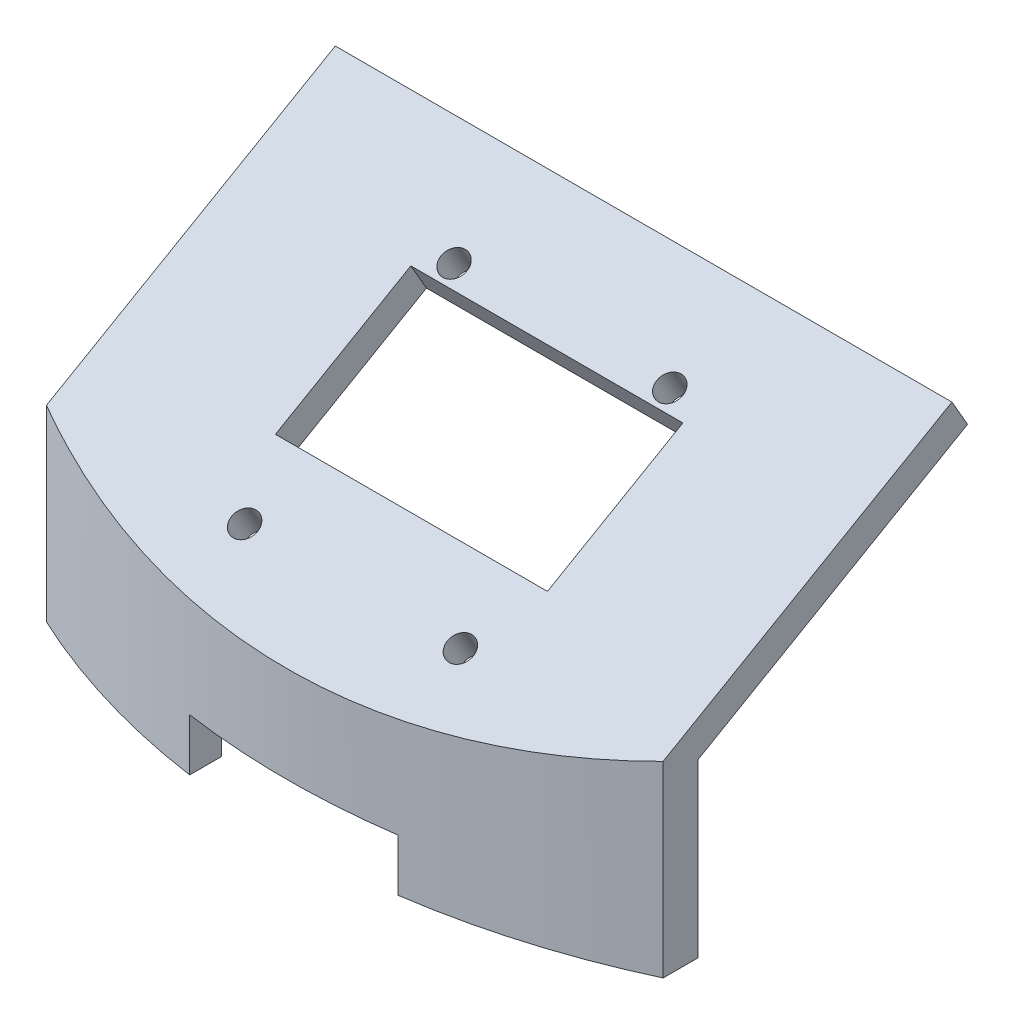
ISO-10303-21;
HEADER;
FILE_DESCRIPTION(('STEP AP214'),'2;1');
FILE_NAME('part.step','',(''),(''),'','','');
FILE_SCHEMA(('AUTOMOTIVE_DESIGN { 1 0 10303 214 1 1 1 1 }'));
ENDSEC;
DATA;
#1=APPLICATION_CONTEXT('core data for automotive mechanical design processes');
#2=APPLICATION_PROTOCOL_DEFINITION('international standard','automotive_design',2000,#1);
#3=PRODUCT_CONTEXT('',#1,'mechanical');
#4=PRODUCT('Part','Part','',(#3));
#5=PRODUCT_RELATED_PRODUCT_CATEGORY('part','',(#4));
#6=PRODUCT_DEFINITION_FORMATION('','',#4);
#7=PRODUCT_DEFINITION_CONTEXT('part definition',#1,'design');
#8=PRODUCT_DEFINITION('design','',#6,#7);
#9=PRODUCT_DEFINITION_SHAPE('','',#8);
#10=(LENGTH_UNIT() NAMED_UNIT(*) SI_UNIT(.MILLI.,.METRE.));
#11=(NAMED_UNIT(*) PLANE_ANGLE_UNIT() SI_UNIT($,.RADIAN.));
#12=(NAMED_UNIT(*) SI_UNIT($,.STERADIAN.) SOLID_ANGLE_UNIT());
#13=UNCERTAINTY_MEASURE_WITH_UNIT(LENGTH_MEASURE(1.E-05),#10,'distance_accuracy_value','');
#14=(GEOMETRIC_REPRESENTATION_CONTEXT(3) GLOBAL_UNCERTAINTY_ASSIGNED_CONTEXT((#13)) GLOBAL_UNIT_ASSIGNED_CONTEXT((#10,
#11,#12)) REPRESENTATION_CONTEXT('',''));
#15=CARTESIAN_POINT('',(0.,0.,0.));
#16=DIRECTION('',(0.,0.,1.));
#17=DIRECTION('',(1.,0.,0.));
#18=AXIS2_PLACEMENT_3D('',#15,#16,#17);
#19=CARTESIAN_POINT('',(0.,18.,0.));
#20=DIRECTION('',(0.,-1.,0.));
#21=DIRECTION('',(0.,0.,-1.));
#22=AXIS2_PLACEMENT_3D('',#19,#20,#21);
#23=CYLINDRICAL_SURFACE('',#22,70.);
#24=DIRECTION('',(0.,-1.,0.));
#25=VECTOR('',#24,1.);
#26=CARTESIAN_POINT('',(10.,18.,69.2820323027551));
#27=LINE('',#26,#25);
#28=CARTESIAN_POINT('',(10.,0.,69.2820323027551));
#29=VERTEX_POINT('',#28);
#30=CARTESIAN_POINT('',(10.,5.,69.2820323027551));
#31=VERTEX_POINT('',#30);
#32=EDGE_CURVE('E156',#29,#31,#27,.F.);
#33=ORIENTED_EDGE('',*,*,#32,.F.);
#34=CARTESIAN_POINT('',(0.,0.,0.));
#35=DIRECTION('',(0.,1.,0.));
#36=DIRECTION('',(0.,0.,1.));
#37=AXIS2_PLACEMENT_3D('',#34,#35,#36);
#38=CIRCLE('',#37,70.);
#39=CARTESIAN_POINT('',(29.5832783218491,0.,63.4415450925655));
#40=VERTEX_POINT('',#39);
#41=EDGE_CURVE('E251',#29,#40,#38,.T.);
#42=ORIENTED_EDGE('',*,*,#41,.T.);
#43=DIRECTION('',(0.,-1.,0.));
#44=VECTOR('',#43,1.);
#45=CARTESIAN_POINT('',(29.5832783218491,18.,63.4415450925655));
#46=LINE('',#45,#44);
#47=CARTESIAN_POINT('',(29.5832783218491,17.9999999999999,63.4415450925654));
#48=VERTEX_POINT('',#47);
#49=EDGE_CURVE('E278',#48,#40,#46,.T.);
#50=ORIENTED_EDGE('',*,*,#49,.F.);
#51=CARTESIAN_POINT('',(0.,54.6279931369983,0.));
#52=DIRECTION('',(0.,-0.866025403784439,-0.499999999999999));
#53=DIRECTION('',(0.,-0.499999999999999,0.866025403784439));
#54=AXIS2_PLACEMENT_3D('',#51,#52,#53);
#55=ELLIPSE('',#54,80.8290376865476,70.);
#56=CARTESIAN_POINT('',(-29.5832783218486,17.9999999999999,63.4415450925657));
#57=VERTEX_POINT('',#56);
#58=EDGE_CURVE('E223',#57,#48,#55,.F.);
#59=ORIENTED_EDGE('',*,*,#58,.F.);
#60=DIRECTION('',(0.,-1.,0.));
#61=VECTOR('',#60,1.);
#62=CARTESIAN_POINT('',(-29.5832783218486,18.,63.4415450925657));
#63=LINE('',#62,#61);
#64=CARTESIAN_POINT('',(-29.5832783218486,0.,63.4415450925657));
#65=VERTEX_POINT('',#64);
#66=EDGE_CURVE('E267',#57,#65,#63,.T.);
#67=ORIENTED_EDGE('',*,*,#66,.T.);
#68=CARTESIAN_POINT('',(-10.,0.,69.2820323027551));
#69=VERTEX_POINT('',#68);
#70=EDGE_CURVE('E170',#65,#69,#38,.T.);
#71=ORIENTED_EDGE('',*,*,#70,.T.);
#72=DIRECTION('',(0.,-1.,0.));
#73=VECTOR('',#72,1.);
#74=CARTESIAN_POINT('',(-10.,18.,69.2820323027551));
#75=LINE('',#74,#73);
#76=CARTESIAN_POINT('',(-10.,5.,69.2820323027551));
#77=VERTEX_POINT('',#76);
#78=EDGE_CURVE('E58',#77,#69,#75,.T.);
#79=ORIENTED_EDGE('',*,*,#78,.F.);
#80=CARTESIAN_POINT('',(0.,5.,0.));
#81=DIRECTION('',(0.,-1.,0.));
#82=DIRECTION('',(1.,0.,0.));
#83=AXIS2_PLACEMENT_3D('',#80,#81,#82);
#84=CIRCLE('',#83,70.);
#85=EDGE_CURVE('E149',#31,#77,#84,.T.);
#86=ORIENTED_EDGE('',*,*,#85,.F.);
#87=EDGE_LOOP('',(#33,#42,#50,#59,#67,#71,#79,#86));
#88=FACE_BOUND('',#87,.T.);
#89=ADVANCED_FACE('F44',(#88),#23,.T.);
#90=CARTESIAN_POINT('',(0.,18.,0.));
#91=DIRECTION('',(0.,-1.,0.));
#92=DIRECTION('',(0.,0.,-1.));
#93=AXIS2_PLACEMENT_3D('',#90,#91,#92);
#94=CYLINDRICAL_SURFACE('',#93,67.);
#95=DIRECTION('',(0.,-1.,0.));
#96=VECTOR('',#95,1.);
#97=CARTESIAN_POINT('',(10.,18.,66.2495283002076));
#98=LINE('',#97,#96);
#99=CARTESIAN_POINT('',(10.,5.,66.2495283002076));
#100=VERTEX_POINT('',#99);
#101=CARTESIAN_POINT('',(10.,0.,66.2495283002076));
#102=VERTEX_POINT('',#101);
#103=EDGE_CURVE('E169',#100,#102,#98,.T.);
#104=ORIENTED_EDGE('',*,*,#103,.F.);
#105=CARTESIAN_POINT('',(0.,5.,0.));
#106=DIRECTION('',(0.,-1.,0.));
#107=DIRECTION('',(1.,0.,0.));
#108=AXIS2_PLACEMENT_3D('',#105,#106,#107);
#109=CIRCLE('',#108,67.);
#110=CARTESIAN_POINT('',(-10.,5.,66.2495283002076));
#111=VERTEX_POINT('',#110);
#112=EDGE_CURVE('E11',#111,#100,#109,.F.);
#113=ORIENTED_EDGE('',*,*,#112,.F.);
#114=DIRECTION('',(0.,-1.,0.));
#115=VECTOR('',#114,1.);
#116=CARTESIAN_POINT('',(-10.,18.,66.2495283002076));
#117=LINE('',#116,#115);
#118=CARTESIAN_POINT('',(-10.,0.,66.2495283002076));
#119=VERTEX_POINT('',#118);
#120=EDGE_CURVE('E162',#119,#111,#117,.F.);
#121=ORIENTED_EDGE('',*,*,#120,.F.);
#122=CARTESIAN_POINT('',(0.,0.,0.));
#123=DIRECTION('',(0.,-1.,0.));
#124=DIRECTION('',(0.,0.,1.));
#125=AXIS2_PLACEMENT_3D('',#122,#123,#124);
#126=CIRCLE('',#125,67.);
#127=CARTESIAN_POINT('',(-29.5832783218487,0.,60.1151365608699));
#128=VERTEX_POINT('',#127);
#129=EDGE_CURVE('E262',#119,#128,#126,.T.);
#130=ORIENTED_EDGE('',*,*,#129,.T.);
#131=DIRECTION('',(0.,-1.,0.));
#132=VECTOR('',#131,1.);
#133=CARTESIAN_POINT('',(-29.5832783218487,18.,60.1151365608699));
#134=LINE('',#133,#132);
#135=CARTESIAN_POINT('',(-29.5832783218485,16.4564012460713,60.11513656087));
#136=VERTEX_POINT('',#135);
#137=EDGE_CURVE('E271',#136,#128,#134,.T.);
#138=ORIENTED_EDGE('',*,*,#137,.F.);
#139=CARTESIAN_POINT('',(0.,51.1638915218605,0.));
#140=DIRECTION('',(0.,-0.866025403784439,-0.499999999999999));
#141=DIRECTION('',(0.,-0.499999999999999,0.866025403784439));
#142=AXIS2_PLACEMENT_3D('',#139,#140,#141);
#143=ELLIPSE('',#142,77.3649360714098,67.);
#144=CARTESIAN_POINT('',(29.5832783218491,16.4564012460713,60.1151365608697));
#145=VERTEX_POINT('',#144);
#146=EDGE_CURVE('E284',#136,#145,#143,.F.);
#147=ORIENTED_EDGE('',*,*,#146,.T.);
#148=DIRECTION('',(0.,-1.,0.));
#149=VECTOR('',#148,1.);
#150=CARTESIAN_POINT('',(29.5832783218491,18.,60.1151365608697));
#151=LINE('',#150,#149);
#152=CARTESIAN_POINT('',(29.5832783218491,0.,60.1151365608697));
#153=VERTEX_POINT('',#152);
#154=EDGE_CURVE('E280',#145,#153,#151,.T.);
#155=ORIENTED_EDGE('',*,*,#154,.T.);
#156=EDGE_CURVE('E265',#153,#102,#126,.T.);
#157=ORIENTED_EDGE('',*,*,#156,.T.);
#158=EDGE_LOOP('',(#104,#113,#121,#130,#138,#147,#155,#157));
#159=FACE_BOUND('',#158,.T.);
#160=ADVANCED_FACE('F335',(#159),#94,.F.);
#161=CARTESIAN_POINT('',(0.,0.,0.));
#162=DIRECTION('',(0.,1.,0.));
#163=DIRECTION('',(0.,0.,1.));
#164=AXIS2_PLACEMENT_3D('',#161,#162,#163);
#165=PLANE('',#164);
#166=DIRECTION('',(0.,0.,1.));
#167=VECTOR('',#166,1.);
#168=CARTESIAN_POINT('',(10.,0.,0.));
#169=LINE('',#168,#167);
#170=EDGE_CURVE('E52',#102,#29,#169,.T.);
#171=ORIENTED_EDGE('',*,*,#170,.F.);
#172=ORIENTED_EDGE('',*,*,#156,.F.);
#173=DIRECTION('',(0.,0.,-1.));
#174=VECTOR('',#173,1.);
#175=CARTESIAN_POINT('',(29.5832783218491,0.,63.4415450925655));
#176=LINE('',#175,#174);
#177=EDGE_CURVE('E260',#40,#153,#176,.T.);
#178=ORIENTED_EDGE('',*,*,#177,.F.);
#179=ORIENTED_EDGE('',*,*,#41,.F.);
#180=EDGE_LOOP('',(#171,#172,#178,#179));
#181=FACE_BOUND('',#180,.T.);
#182=ADVANCED_FACE('F327',(#181),#165,.F.);
#183=DIRECTION('',(0.,0.,-1.));
#184=VECTOR('',#183,1.);
#185=CARTESIAN_POINT('',(-10.,0.,0.));
#186=LINE('',#185,#184);
#187=EDGE_CURVE('E301',#69,#119,#186,.T.);
#188=ORIENTED_EDGE('',*,*,#187,.F.);
#189=ORIENTED_EDGE('',*,*,#70,.F.);
#190=DIRECTION('',(0.,0.,1.));
#191=VECTOR('',#190,1.);
#192=CARTESIAN_POINT('',(-29.5832783218486,0.,63.4415450925657));
#193=LINE('',#192,#191);
#194=EDGE_CURVE('E268',#128,#65,#193,.T.);
#195=ORIENTED_EDGE('',*,*,#194,.F.);
#196=ORIENTED_EDGE('',*,*,#129,.F.);
#197=EDGE_LOOP('',(#188,#189,#195,#196));
#198=FACE_BOUND('',#197,.T.);
#199=ADVANCED_FACE('F339',(#198),#165,.F.);
#200=CARTESIAN_POINT('',(-29.5832783218486,18.,63.4415450925657));
#201=DIRECTION('',(1.,0.,0.));
#202=DIRECTION('',(0.,0.,-1.));
#203=AXIS2_PLACEMENT_3D('',#200,#201,#202);
#204=PLANE('',#203);
#205=ORIENTED_EDGE('',*,*,#66,.F.);
#206=DIRECTION('',(0.,0.499999999999999,-0.86602540378444));
#207=VECTOR('',#206,1.);
#208=CARTESIAN_POINT('',(-29.5832783218486,17.9999999999999,63.4415450925656));
#209=LINE('',#208,#207);
#210=CARTESIAN_POINT('',(-29.5832783218486,34.,35.7287321714634));
#211=VERTEX_POINT('',#210);
#212=EDGE_CURVE('E222',#57,#211,#209,.T.);
#213=ORIENTED_EDGE('',*,*,#212,.T.);
#214=DIRECTION('',(0.,0.866025403784439,0.499999999999999));
#215=VECTOR('',#214,1.);
#216=CARTESIAN_POINT('',(-29.5832783218486,31.4019237886466,34.2287321714634));
#217=LINE('',#216,#215);
#218=CARTESIAN_POINT('',(-29.5832783218486,31.4019237886466,34.2287321714634));
#219=VERTEX_POINT('',#218);
#220=EDGE_CURVE('E249',#219,#211,#217,.T.);
#221=ORIENTED_EDGE('',*,*,#220,.F.);
#222=DIRECTION('',(0.,0.499999999999999,-0.866025403784439));
#223=VECTOR('',#222,1.);
#224=CARTESIAN_POINT('',(-29.5832783218486,15.4019237886466,61.9415450925656));
#225=LINE('',#224,#223);
#226=EDGE_CURVE('E227',#136,#219,#225,.T.);
#227=ORIENTED_EDGE('',*,*,#226,.F.);
#228=ORIENTED_EDGE('',*,*,#137,.T.);
#229=ORIENTED_EDGE('',*,*,#194,.T.);
#230=EDGE_LOOP('',(#205,#213,#221,#227,#228,#229));
#231=FACE_BOUND('',#230,.T.);
#232=ADVANCED_FACE('F340',(#231),#204,.F.);
#233=CARTESIAN_POINT('',(0.,40.9709948527488,23.6546149072012));
#234=DIRECTION('',(0.,-0.866025403784439,-0.499999999999999));
#235=DIRECTION('',(0.,0.499999999999999,-0.866025403784439));
#236=AXIS2_PLACEMENT_3D('',#233,#234,#235);
#237=PLANE('',#236);
#238=CARTESIAN_POINT('',(-10.3499999999999,17.875,63.6580514435116));
#239=DIRECTION('',(0.,0.866025403784439,0.499999999999998));
#240=DIRECTION('',(0.,-0.499999999999999,0.86602540378444));
#241=AXIS2_PLACEMENT_3D('',#238,#239,#240);
#242=CIRCLE('',#241,1.25);
#243=CARTESIAN_POINT('',(-10.3499999999999,17.25,64.7405831982421));
#244=VERTEX_POINT('',#243);
#245=EDGE_CURVE('E160',#244,#244,#242,.T.);
#246=ORIENTED_EDGE('',*,*,#245,.F.);
#247=EDGE_LOOP('',(#246));
#248=FACE_BOUND('',#247,.T.);
#249=CARTESIAN_POINT('',(10.3500000000001,17.875,63.6580514435116));
#250=DIRECTION('',(0.,0.866025403784439,0.499999999999998));
#251=DIRECTION('',(0.,-0.499999999999999,0.86602540378444));
#252=AXIS2_PLACEMENT_3D('',#249,#250,#251);
#253=CIRCLE('',#252,1.25);
#254=CARTESIAN_POINT('',(10.3500000000001,17.25,64.7405831982421));
#255=VERTEX_POINT('',#254);
#256=EDGE_CURVE('E190',#255,#255,#253,.T.);
#257=ORIENTED_EDGE('',*,*,#256,.F.);
#258=EDGE_LOOP('',(#257));
#259=FACE_BOUND('',#258,.T.);
#260=CARTESIAN_POINT('',(-10.3499999999999,29.475,43.5662620757126));
#261=DIRECTION('',(0.,0.866025403784439,0.499999999999998));
#262=DIRECTION('',(0.,-0.499999999999999,0.86602540378444));
#263=AXIS2_PLACEMENT_3D('',#260,#261,#262);
#264=CIRCLE('',#263,1.25);
#265=CARTESIAN_POINT('',(-10.3499999999999,28.85,44.6487938304432));
#266=VERTEX_POINT('',#265);
#267=EDGE_CURVE('E182',#266,#266,#264,.T.);
#268=ORIENTED_EDGE('',*,*,#267,.F.);
#269=EDGE_LOOP('',(#268));
#270=FACE_BOUND('',#269,.T.);
#271=CARTESIAN_POINT('',(10.3500000000001,29.4749999999999,43.5662620757126));
#272=DIRECTION('',(0.,0.866025403784439,0.499999999999998));
#273=DIRECTION('',(0.,-0.499999999999999,0.86602540378444));
#274=AXIS2_PLACEMENT_3D('',#271,#272,#273);
#275=CIRCLE('',#274,1.25);
#276=CARTESIAN_POINT('',(10.3500000000001,28.8499999999999,44.6487938304431));
#277=VERTEX_POINT('',#276);
#278=EDGE_CURVE('E177',#277,#277,#275,.T.);
#279=ORIENTED_EDGE('',*,*,#278,.F.);
#280=EDGE_LOOP('',(#279));
#281=FACE_BOUND('',#280,.T.);
#282=DIRECTION('',(-1.,0.,0.));
#283=VECTOR('',#282,1.);
#284=CARTESIAN_POINT('',(-13.0499999999999,28.64,45.0125245000326));
#285=LINE('',#284,#283);
#286=CARTESIAN_POINT('',(13.0500000000001,28.6399999999999,45.0125245000326));
#287=VERTEX_POINT('',#286);
#288=CARTESIAN_POINT('',(-13.0499999999999,28.64,45.0125245000326));
#289=VERTEX_POINT('',#288);
#290=EDGE_CURVE('E197',#287,#289,#285,.T.);
#291=ORIENTED_EDGE('',*,*,#290,.F.);
#292=DIRECTION('',(0.,0.499999999999999,-0.86602540378444));
#293=VECTOR('',#292,1.);
#294=CARTESIAN_POINT('',(13.0500000000001,21.1399999999999,58.0029055567992));
#295=LINE('',#294,#293);
#296=CARTESIAN_POINT('',(13.0500000000001,21.1399999999999,58.0029055567992));
#297=VERTEX_POINT('',#296);
#298=EDGE_CURVE('E68',#297,#287,#295,.T.);
#299=ORIENTED_EDGE('',*,*,#298,.F.);
#300=DIRECTION('',(1.,0.,0.));
#301=VECTOR('',#300,1.);
#302=CARTESIAN_POINT('',(-13.0499999999999,21.14,58.0029055567992));
#303=LINE('',#302,#301);
#304=CARTESIAN_POINT('',(-13.0499999999999,21.14,58.0029055567992));
#305=VERTEX_POINT('',#304);
#306=EDGE_CURVE('E204',#305,#297,#303,.T.);
#307=ORIENTED_EDGE('',*,*,#306,.F.);
#308=DIRECTION('',(0.,-0.499999999999998,0.86602540378444));
#309=VECTOR('',#308,1.);
#310=CARTESIAN_POINT('',(-13.0499999999999,21.14,58.0029055567992));
#311=LINE('',#310,#309);
#312=EDGE_CURVE('E196',#289,#305,#311,.T.);
#313=ORIENTED_EDGE('',*,*,#312,.F.);
#314=EDGE_LOOP('',(#291,#299,#307,#313));
#315=FACE_BOUND('',#314,.T.);
#316=ORIENTED_EDGE('',*,*,#58,.T.);
#317=DIRECTION('',(0.,-0.499999999999998,0.86602540378444));
#318=VECTOR('',#317,1.);
#319=CARTESIAN_POINT('',(29.5832783218491,17.9999999999999,63.4415450925654));
#320=LINE('',#319,#318);
#321=CARTESIAN_POINT('',(29.5832783218491,33.9999999999999,35.7287321714633));
#322=VERTEX_POINT('',#321);
#323=EDGE_CURVE('E233',#322,#48,#320,.T.);
#324=ORIENTED_EDGE('',*,*,#323,.F.);
#325=DIRECTION('',(1.,0.,0.));
#326=VECTOR('',#325,1.);
#327=CARTESIAN_POINT('',(-29.5832783218486,34.,35.7287321714634));
#328=LINE('',#327,#326);
#329=EDGE_CURVE('E239',#211,#322,#328,.T.);
#330=ORIENTED_EDGE('',*,*,#329,.F.);
#331=ORIENTED_EDGE('',*,*,#212,.F.);
#332=EDGE_LOOP('',(#316,#324,#330,#331));
#333=FACE_BOUND('',#332,.T.);
#334=ADVANCED_FACE('F350',(#248,#259,#270,#281,#315,#333),#237,.F.);
#335=CARTESIAN_POINT('',(29.5832783218491,18.,63.4415450925655));
#336=DIRECTION('',(-1.,0.,0.));
#337=DIRECTION('',(0.,0.,1.));
#338=AXIS2_PLACEMENT_3D('',#335,#336,#337);
#339=PLANE('',#338);
#340=ORIENTED_EDGE('',*,*,#323,.T.);
#341=ORIENTED_EDGE('',*,*,#49,.T.);
#342=ORIENTED_EDGE('',*,*,#177,.T.);
#343=ORIENTED_EDGE('',*,*,#154,.F.);
#344=DIRECTION('',(0.,-0.499999999999999,0.86602540378444));
#345=VECTOR('',#344,1.);
#346=CARTESIAN_POINT('',(29.5832783218491,15.4019237886466,61.9415450925654));
#347=LINE('',#346,#345);
#348=CARTESIAN_POINT('',(29.5832783218491,31.4019237886465,34.2287321714633));
#349=VERTEX_POINT('',#348);
#350=EDGE_CURVE('E234',#349,#145,#347,.T.);
#351=ORIENTED_EDGE('',*,*,#350,.F.);
#352=DIRECTION('',(0.,0.866025403784439,0.499999999999999));
#353=VECTOR('',#352,1.);
#354=CARTESIAN_POINT('',(29.5832783218491,31.4019237886465,34.2287321714633));
#355=LINE('',#354,#353);
#356=EDGE_CURVE('E240',#349,#322,#355,.T.);
#357=ORIENTED_EDGE('',*,*,#356,.T.);
#358=EDGE_LOOP('',(#340,#341,#342,#343,#351,#357));
#359=FACE_BOUND('',#358,.T.);
#360=ADVANCED_FACE('F356',(#359),#339,.F.);
#361=CARTESIAN_POINT('',(-29.5832783218486,31.4019237886466,34.2287321714634));
#362=DIRECTION('',(0.,-0.499999999999999,0.866025403784439));
#363=DIRECTION('',(0.,-0.866025403784439,-0.499999999999999));
#364=AXIS2_PLACEMENT_3D('',#361,#362,#363);
#365=PLANE('',#364);
#366=ORIENTED_EDGE('',*,*,#329,.T.);
#367=ORIENTED_EDGE('',*,*,#356,.F.);
#368=DIRECTION('',(1.,0.,0.));
#369=VECTOR('',#368,1.);
#370=CARTESIAN_POINT('',(-29.5832783218486,31.4019237886466,34.2287321714634));
#371=LINE('',#370,#369);
#372=EDGE_CURVE('E229',#219,#349,#371,.T.);
#373=ORIENTED_EDGE('',*,*,#372,.F.);
#374=ORIENTED_EDGE('',*,*,#220,.T.);
#375=EDGE_LOOP('',(#366,#367,#373,#374));
#376=FACE_BOUND('',#375,.T.);
#377=ADVANCED_FACE('F359',(#376),#365,.F.);
#378=CARTESIAN_POINT('',(0.,38.3729186413955,22.1546149072012));
#379=DIRECTION('',(0.,-0.866025403784439,-0.499999999999999));
#380=DIRECTION('',(0.,0.499999999999999,-0.866025403784439));
#381=AXIS2_PLACEMENT_3D('',#378,#379,#380);
#382=PLANE('',#381);
#383=CARTESIAN_POINT('',(-10.3499999999999,15.2769237886466,62.1580514435116));
#384=DIRECTION('',(0.,-0.866025403784439,-0.499999999999999));
#385=DIRECTION('',(0.,0.499999999999999,-0.866025403784439));
#386=AXIS2_PLACEMENT_3D('',#383,#384,#385);
#387=CIRCLE('',#386,1.25);
#388=CARTESIAN_POINT('',(-10.3499999999999,14.6519237886466,63.2405831982421));
#389=VERTEX_POINT('',#388);
#390=EDGE_CURVE('E228',#389,#389,#387,.T.);
#391=ORIENTED_EDGE('',*,*,#390,.F.);
#392=EDGE_LOOP('',(#391));
#393=FACE_BOUND('',#392,.T.);
#394=CARTESIAN_POINT('',(10.3500000000001,15.2769237886466,62.1580514435115));
#395=DIRECTION('',(0.,-0.866025403784439,-0.499999999999999));
#396=DIRECTION('',(0.,0.499999999999999,-0.866025403784439));
#397=AXIS2_PLACEMENT_3D('',#394,#395,#396);
#398=CIRCLE('',#397,1.25);
#399=CARTESIAN_POINT('',(10.3500000000001,14.6519237886466,63.2405831982421));
#400=VERTEX_POINT('',#399);
#401=EDGE_CURVE('E307',#400,#400,#398,.T.);
#402=ORIENTED_EDGE('',*,*,#401,.F.);
#403=EDGE_LOOP('',(#402));
#404=FACE_BOUND('',#403,.T.);
#405=CARTESIAN_POINT('',(-10.3499999999999,26.8769237886466,42.0662620757126));
#406=DIRECTION('',(0.,-0.866025403784439,-0.499999999999999));
#407=DIRECTION('',(0.,0.499999999999999,-0.866025403784439));
#408=AXIS2_PLACEMENT_3D('',#405,#406,#407);
#409=CIRCLE('',#408,1.25);
#410=CARTESIAN_POINT('',(-10.3499999999999,26.2519237886466,43.1487938304431));
#411=VERTEX_POINT('',#410);
#412=EDGE_CURVE('E304',#411,#411,#409,.T.);
#413=ORIENTED_EDGE('',*,*,#412,.F.);
#414=EDGE_LOOP('',(#413));
#415=FACE_BOUND('',#414,.T.);
#416=CARTESIAN_POINT('',(10.3500000000001,26.8769237886466,42.0662620757126));
#417=DIRECTION('',(0.,-0.866025403784439,-0.499999999999999));
#418=DIRECTION('',(0.,0.499999999999999,-0.866025403784439));
#419=AXIS2_PLACEMENT_3D('',#416,#417,#418);
#420=CIRCLE('',#419,1.25);
#421=CARTESIAN_POINT('',(10.3500000000001,26.2519237886466,43.1487938304431));
#422=VERTEX_POINT('',#421);
#423=EDGE_CURVE('E215',#422,#422,#420,.T.);
#424=ORIENTED_EDGE('',*,*,#423,.F.);
#425=EDGE_LOOP('',(#424));
#426=FACE_BOUND('',#425,.T.);
#427=DIRECTION('',(0.,-0.499999999999999,0.866025403784439));
#428=VECTOR('',#427,1.);
#429=CARTESIAN_POINT('',(13.0500000000001,38.3729186413954,22.1546149072012));
#430=LINE('',#429,#428);
#431=CARTESIAN_POINT('',(13.0500000000001,26.0419237886466,43.5125245000326));
#432=VERTEX_POINT('',#431);
#433=CARTESIAN_POINT('',(13.0500000000001,18.5419237886466,56.5029055567992));
#434=VERTEX_POINT('',#433);
#435=EDGE_CURVE('E296',#432,#434,#430,.T.);
#436=ORIENTED_EDGE('',*,*,#435,.F.);
#437=DIRECTION('',(1.,0.,0.));
#438=VECTOR('',#437,1.);
#439=CARTESIAN_POINT('',(0.,26.0419237886466,43.5125245000326));
#440=LINE('',#439,#438);
#441=CARTESIAN_POINT('',(-13.0499999999999,26.0419237886466,43.5125245000326));
#442=VERTEX_POINT('',#441);
#443=EDGE_CURVE('E286',#442,#432,#440,.T.);
#444=ORIENTED_EDGE('',*,*,#443,.F.);
#445=DIRECTION('',(0.,0.499999999999999,-0.866025403784439));
#446=VECTOR('',#445,1.);
#447=CARTESIAN_POINT('',(-13.0499999999999,38.3729186413955,22.1546149072012));
#448=LINE('',#447,#446);
#449=CARTESIAN_POINT('',(-13.0499999999999,18.5419237886466,56.5029055567992));
#450=VERTEX_POINT('',#449);
#451=EDGE_CURVE('E293',#450,#442,#448,.T.);
#452=ORIENTED_EDGE('',*,*,#451,.F.);
#453=DIRECTION('',(-1.,0.,0.));
#454=VECTOR('',#453,1.);
#455=CARTESIAN_POINT('',(0.,18.5419237886466,56.5029055567992));
#456=LINE('',#455,#454);
#457=EDGE_CURVE('E294',#434,#450,#456,.T.);
#458=ORIENTED_EDGE('',*,*,#457,.F.);
#459=EDGE_LOOP('',(#436,#444,#452,#458));
#460=FACE_BOUND('',#459,.T.);
#461=ORIENTED_EDGE('',*,*,#146,.F.);
#462=ORIENTED_EDGE('',*,*,#226,.T.);
#463=ORIENTED_EDGE('',*,*,#372,.T.);
#464=ORIENTED_EDGE('',*,*,#350,.T.);
#465=EDGE_LOOP('',(#461,#462,#463,#464));
#466=FACE_BOUND('',#465,.T.);
#467=ADVANCED_FACE('F366',(#393,#404,#415,#426,#460,#466),#382,.T.);
#468=CARTESIAN_POINT('',(13.0500000000001,15.0778221735089,54.5029055567992));
#469=DIRECTION('',(1.,0.,0.));
#470=DIRECTION('',(0.,1.,0.));
#471=AXIS2_PLACEMENT_3D('',#468,#469,#470);
#472=PLANE('',#471);
#473=ORIENTED_EDGE('',*,*,#435,.T.);
#474=DIRECTION('',(0.,0.866025403784439,0.499999999999999));
#475=VECTOR('',#474,1.);
#476=CARTESIAN_POINT('',(13.0500000000001,15.0778221735089,54.5029055567992));
#477=LINE('',#476,#475);
#478=EDGE_CURVE('E209',#434,#297,#477,.T.);
#479=ORIENTED_EDGE('',*,*,#478,.T.);
#480=ORIENTED_EDGE('',*,*,#298,.T.);
#481=DIRECTION('',(0.,0.866025403784439,0.499999999999999));
#482=VECTOR('',#481,1.);
#483=CARTESIAN_POINT('',(13.0500000000001,22.5778221735089,41.5125245000326));
#484=LINE('',#483,#482);
#485=EDGE_CURVE('E206',#432,#287,#484,.T.);
#486=ORIENTED_EDGE('',*,*,#485,.F.);
#487=EDGE_LOOP('',(#473,#479,#480,#486));
#488=FACE_BOUND('',#487,.T.);
#489=ADVANCED_FACE('F382',(#488),#472,.F.);
#490=CARTESIAN_POINT('',(-13.0499999999999,15.0778221735089,54.5029055567992));
#491=DIRECTION('',(0.,-0.499999999999999,0.866025403784439));
#492=DIRECTION('',(0.,-0.866025403784439,-0.499999999999999));
#493=AXIS2_PLACEMENT_3D('',#490,#491,#492);
#494=PLANE('',#493);
#495=ORIENTED_EDGE('',*,*,#457,.T.);
#496=DIRECTION('',(0.,0.866025403784439,0.499999999999999));
#497=VECTOR('',#496,1.);
#498=CARTESIAN_POINT('',(-13.0499999999999,15.0778221735089,54.5029055567992));
#499=LINE('',#498,#497);
#500=EDGE_CURVE('E214',#450,#305,#499,.T.);
#501=ORIENTED_EDGE('',*,*,#500,.T.);
#502=ORIENTED_EDGE('',*,*,#306,.T.);
#503=ORIENTED_EDGE('',*,*,#478,.F.);
#504=EDGE_LOOP('',(#495,#501,#502,#503));
#505=FACE_BOUND('',#504,.T.);
#506=ADVANCED_FACE('F390',(#505),#494,.F.);
#507=CARTESIAN_POINT('',(-13.0499999999999,15.0778221735089,54.5029055567992));
#508=DIRECTION('',(-1.,0.,0.));
#509=DIRECTION('',(0.,-1.,0.));
#510=AXIS2_PLACEMENT_3D('',#507,#508,#509);
#511=PLANE('',#510);
#512=ORIENTED_EDGE('',*,*,#451,.T.);
#513=DIRECTION('',(0.,0.866025403784439,0.499999999999999));
#514=VECTOR('',#513,1.);
#515=CARTESIAN_POINT('',(-13.0499999999999,22.5778221735089,41.5125245000326));
#516=LINE('',#515,#514);
#517=EDGE_CURVE('E217',#442,#289,#516,.T.);
#518=ORIENTED_EDGE('',*,*,#517,.T.);
#519=ORIENTED_EDGE('',*,*,#312,.T.);
#520=ORIENTED_EDGE('',*,*,#500,.F.);
#521=EDGE_LOOP('',(#512,#518,#519,#520));
#522=FACE_BOUND('',#521,.T.);
#523=ADVANCED_FACE('F398',(#522),#511,.F.);
#524=CARTESIAN_POINT('',(-13.0499999999999,22.5778221735089,41.5125245000326));
#525=DIRECTION('',(0.,0.499999999999999,-0.866025403784439));
#526=DIRECTION('',(0.,0.866025403784439,0.499999999999999));
#527=AXIS2_PLACEMENT_3D('',#524,#525,#526);
#528=PLANE('',#527);
#529=ORIENTED_EDGE('',*,*,#443,.T.);
#530=ORIENTED_EDGE('',*,*,#485,.T.);
#531=ORIENTED_EDGE('',*,*,#290,.T.);
#532=ORIENTED_EDGE('',*,*,#517,.F.);
#533=EDGE_LOOP('',(#529,#530,#531,#532));
#534=FACE_BOUND('',#533,.T.);
#535=ADVANCED_FACE('F395',(#534),#528,.F.);
#536=CARTESIAN_POINT('',(10.3500000000001,23.4128221735089,40.0662620757126));
#537=DIRECTION('',(0.,0.866025403784439,0.499999999999999));
#538=DIRECTION('',(0.,-0.499999999999999,0.866025403784439));
#539=AXIS2_PLACEMENT_3D('',#536,#537,#538);
#540=CYLINDRICAL_SURFACE('',#539,1.25);
#541=CARTESIAN_POINT('',(10.3500000000001,26.2519237886466,43.1487938304431));
#542=CARTESIAN_POINT('',(10.3500000000001,26.2789870825149,43.1644188304431));
#543=CARTESIAN_POINT('',(10.3500000000001,26.3060503763831,43.1800438304431));
#544=CARTESIAN_POINT('',(10.3500000000001,26.3601769641196,43.2112938304431));
#545=CARTESIAN_POINT('',(10.3500000000001,26.3872402579879,43.2269188304431));
#546=CARTESIAN_POINT('',(10.3500000000001,26.4413668457244,43.2581688304431));
#547=CARTESIAN_POINT('',(10.3500000000001,26.4684301395927,43.2737938304431));
#548=CARTESIAN_POINT('',(10.3500000000001,26.5225567273292,43.3050438304431));
#549=CARTESIAN_POINT('',(10.3500000000001,26.5496200211975,43.3206688304431));
#550=CARTESIAN_POINT('',(10.3500000000001,26.603746608934,43.3519188304431));
#551=CARTESIAN_POINT('',(10.3500000000001,26.6308099028023,43.3675438304431));
#552=CARTESIAN_POINT('',(10.3500000000001,26.6849364905388,43.3987938304431));
#553=CARTESIAN_POINT('',(10.3500000000001,26.7119997844071,43.4144188304431));
#554=CARTESIAN_POINT('',(10.3500000000001,26.7661263721436,43.4456688304431));
#555=CARTESIAN_POINT('',(10.3500000000001,26.7931896660119,43.4612938304431));
#556=CARTESIAN_POINT('',(10.3500000000001,26.8473162537484,43.4925438304431));
#557=CARTESIAN_POINT('',(10.3500000000001,26.8743795476167,43.5081688304431));
#558=CARTESIAN_POINT('',(10.3500000000001,26.9285061353532,43.5394188304431));
#559=CARTESIAN_POINT('',(10.3500000000001,26.9555694292215,43.5550438304431));
#560=CARTESIAN_POINT('',(10.3500000000001,27.009696016958,43.5862938304431));
#561=CARTESIAN_POINT('',(10.3500000000001,27.0367593108262,43.6019188304431));
#562=CARTESIAN_POINT('',(10.3500000000001,27.0908858985628,43.6331688304431));
#563=CARTESIAN_POINT('',(10.3500000000001,27.117949192431,43.6487938304431));
#564=CARTESIAN_POINT('',(10.3500000000001,27.1720757801676,43.6800438304431));
#565=CARTESIAN_POINT('',(10.3500000000001,27.1991390740358,43.6956688304431));
#566=CARTESIAN_POINT('',(10.3500000000001,27.2532656617724,43.7269188304431));
#567=CARTESIAN_POINT('',(10.3500000000001,27.2803289556406,43.7425438304431));
#568=CARTESIAN_POINT('',(10.3500000000001,27.3344555433771,43.7737938304431));
#569=CARTESIAN_POINT('',(10.3500000000001,27.3615188372454,43.7894188304431));
#570=CARTESIAN_POINT('',(10.3500000000001,27.4156454249819,43.8206688304431));
#571=CARTESIAN_POINT('',(10.3500000000001,27.4427087188502,43.8362938304431));
#572=CARTESIAN_POINT('',(10.3500000000001,27.4968353065867,43.8675438304431));
#573=CARTESIAN_POINT('',(10.3500000000001,27.523898600455,43.8831688304431));
#574=CARTESIAN_POINT('',(10.3500000000001,27.5780251881915,43.9144188304431));
#575=CARTESIAN_POINT('',(10.3500000000001,27.6050884820598,43.9300438304431));
#576=CARTESIAN_POINT('',(10.3500000000001,27.6592150697963,43.9612938304431));
#577=CARTESIAN_POINT('',(10.3500000000001,27.6862783636646,43.9769188304431));
#578=CARTESIAN_POINT('',(10.3500000000001,27.7404049514011,44.0081688304431));
#579=CARTESIAN_POINT('',(10.3500000000001,27.7674682452694,44.0237938304431));
#580=CARTESIAN_POINT('',(10.3500000000001,27.8215948330059,44.0550438304431));
#581=CARTESIAN_POINT('',(10.3500000000001,27.8486581268742,44.0706688304431));
#582=CARTESIAN_POINT('',(10.3500000000001,27.9027847146107,44.1019188304431));
#583=CARTESIAN_POINT('',(10.3500000000001,27.929848008479,44.1175438304431));
#584=CARTESIAN_POINT('',(10.3500000000001,27.9839745962155,44.1487938304431));
#585=CARTESIAN_POINT('',(10.3500000000001,28.0110378900838,44.1644188304431));
#586=CARTESIAN_POINT('',(10.3500000000001,28.0651644778203,44.1956688304431));
#587=CARTESIAN_POINT('',(10.3500000000001,28.0922277716885,44.2112938304431));
#588=CARTESIAN_POINT('',(10.3500000000001,28.1463543594251,44.2425438304431));
#589=CARTESIAN_POINT('',(10.3500000000001,28.1734176532933,44.2581688304431));
#590=CARTESIAN_POINT('',(10.3500000000001,28.2275442410299,44.2894188304431));
#591=CARTESIAN_POINT('',(10.3500000000001,28.2546075348981,44.3050438304431));
#592=CARTESIAN_POINT('',(10.3500000000001,28.3087341226347,44.3362938304431));
#593=CARTESIAN_POINT('',(10.3500000000001,28.3357974165029,44.3519188304431));
#594=CARTESIAN_POINT('',(10.3500000000001,28.3899240042394,44.3831688304431));
#595=CARTESIAN_POINT('',(10.3500000000001,28.4169872981077,44.3987938304431));
#596=CARTESIAN_POINT('',(10.3500000000001,28.4711138858442,44.4300438304431));
#597=CARTESIAN_POINT('',(10.3500000000001,28.4981771797125,44.4456688304431));
#598=CARTESIAN_POINT('',(10.3500000000001,28.552303767449,44.4769188304431));
#599=CARTESIAN_POINT('',(10.3500000000001,28.5793670613173,44.4925438304431));
#600=CARTESIAN_POINT('',(10.3500000000001,28.6334936490538,44.5237938304431));
#601=CARTESIAN_POINT('',(10.3500000000001,28.6605569429221,44.5394188304431));
#602=CARTESIAN_POINT('',(10.3500000000001,28.7146835306586,44.5706688304431));
#603=CARTESIAN_POINT('',(10.3500000000001,28.7417468245269,44.5862938304431));
#604=CARTESIAN_POINT('',(10.3500000000001,28.7958734122634,44.6175438304431));
#605=CARTESIAN_POINT('',(10.3500000000001,28.8229367061317,44.6331688304431));
#606=CARTESIAN_POINT('',(10.3500000000001,28.8499999999999,44.6487938304431));
#607=B_SPLINE_CURVE_WITH_KNOTS('',3,(#541,#542,#543,#544,#545,#546,#547,#548,#549,#550,#551,
#552,#553,#554,#555,#556,#557,#558,#559,#560,#561,#562,#563,#564,#565,#566,#567,#568,#569,#570,
#571,#572,#573,#574,#575,#576,#577,#578,#579,#580,#581,#582,#583,#584,#585,#586,#587,#588,#589,
#590,#591,#592,#593,#594,#595,#596,#597,#598,#599,#600,#601,#602,#603,#604,#605,#606),
.UNSPECIFIED.,.F.,.F.,(4,2,2,2,2,2,2,2,2,2,2,2,2,2,2,2,2,2,2,2,2,2,2,2,2,2,2,2,2,2,2,2,4),(0.,
0.0937500000000012,0.187500000000002,0.281250000000004,0.375000000000005,0.468750000000003,
0.562500000000004,0.656250000000008,0.750000000000009,0.843750000000011,0.937500000000011,
1.03125000000001,1.12500000000001,1.21875000000001,1.31250000000002,1.40625000000001,
1.50000000000001,1.59375000000002,1.68750000000002,1.78125000000002,1.87500000000002,
1.96875000000002,2.06250000000002,2.15625000000003,2.25000000000003,2.34375000000003,
2.43750000000003,2.53125000000003,2.62500000000003,2.71875000000003,2.81250000000004,
2.90625000000004,3.00000000000004),.UNSPECIFIED.);
#608=EDGE_CURVE('BSEAM391',#422,#277,#607,.T.);
#609=ORIENTED_EDGE('',*,*,#423,.T.);
#610=ORIENTED_EDGE('',*,*,#278,.T.);
#611=ORIENTED_EDGE('',*,*,#608,.T.);
#612=ORIENTED_EDGE('',*,*,#608,.F.);
#613=EDGE_LOOP('',(#609,#611,#610,#612));
#614=FACE_BOUND('',#613,.T.);
#615=ADVANCED_FACE('F391',(#614),#540,.F.);
#616=CARTESIAN_POINT('',(-10.3499999999999,23.4128221735089,40.0662620757126));
#617=DIRECTION('',(0.,0.866025403784439,0.499999999999999));
#618=DIRECTION('',(0.,-0.499999999999999,0.866025403784439));
#619=AXIS2_PLACEMENT_3D('',#616,#617,#618);
#620=CYLINDRICAL_SURFACE('',#619,1.25);
#621=CARTESIAN_POINT('',(-10.3499999999999,26.2519237886466,43.1487938304431));
#622=CARTESIAN_POINT('',(-10.3499999999999,26.2789870825149,43.1644188304431));
#623=CARTESIAN_POINT('',(-10.3499999999999,26.3060503763831,43.1800438304431));
#624=CARTESIAN_POINT('',(-10.3499999999999,26.3601769641197,43.2112938304431));
#625=CARTESIAN_POINT('',(-10.3499999999999,26.3872402579879,43.2269188304431));
#626=CARTESIAN_POINT('',(-10.3499999999999,26.4413668457245,43.2581688304431));
#627=CARTESIAN_POINT('',(-10.3499999999999,26.4684301395927,43.2737938304431));
#628=CARTESIAN_POINT('',(-10.3499999999999,26.5225567273293,43.3050438304431));
#629=CARTESIAN_POINT('',(-10.3499999999999,26.5496200211975,43.3206688304431));
#630=CARTESIAN_POINT('',(-10.3499999999999,26.603746608934,43.3519188304431));
#631=CARTESIAN_POINT('',(-10.3499999999999,26.6308099028023,43.3675438304431));
#632=CARTESIAN_POINT('',(-10.3499999999999,26.6849364905388,43.3987938304431));
#633=CARTESIAN_POINT('',(-10.3499999999999,26.7119997844071,43.4144188304431));
#634=CARTESIAN_POINT('',(-10.3499999999999,26.7661263721436,43.4456688304431));
#635=CARTESIAN_POINT('',(-10.3499999999999,26.7931896660119,43.4612938304431));
#636=CARTESIAN_POINT('',(-10.3499999999999,26.8473162537484,43.4925438304431));
#637=CARTESIAN_POINT('',(-10.3499999999999,26.8743795476167,43.5081688304431));
#638=CARTESIAN_POINT('',(-10.3499999999999,26.9285061353532,43.5394188304431));
#639=CARTESIAN_POINT('',(-10.3499999999999,26.9555694292215,43.5550438304431));
#640=CARTESIAN_POINT('',(-10.3499999999999,27.009696016958,43.5862938304431));
#641=CARTESIAN_POINT('',(-10.3499999999999,27.0367593108263,43.6019188304431));
#642=CARTESIAN_POINT('',(-10.3499999999999,27.0908858985628,43.6331688304431));
#643=CARTESIAN_POINT('',(-10.3499999999999,27.1179491924311,43.6487938304431));
#644=CARTESIAN_POINT('',(-10.3499999999999,27.1720757801676,43.6800438304431));
#645=CARTESIAN_POINT('',(-10.3499999999999,27.1991390740359,43.6956688304431));
#646=CARTESIAN_POINT('',(-10.3499999999999,27.2532656617724,43.7269188304431));
#647=CARTESIAN_POINT('',(-10.3499999999999,27.2803289556406,43.7425438304431));
#648=CARTESIAN_POINT('',(-10.3499999999999,27.3344555433772,43.7737938304431));
#649=CARTESIAN_POINT('',(-10.3499999999999,27.3615188372454,43.7894188304431));
#650=CARTESIAN_POINT('',(-10.3499999999999,27.415645424982,43.8206688304431));
#651=CARTESIAN_POINT('',(-10.3499999999999,27.4427087188502,43.8362938304431));
#652=CARTESIAN_POINT('',(-10.3499999999999,27.4968353065868,43.8675438304431));
#653=CARTESIAN_POINT('',(-10.3499999999999,27.523898600455,43.8831688304431));
#654=CARTESIAN_POINT('',(-10.3499999999999,27.5780251881916,43.9144188304431));
#655=CARTESIAN_POINT('',(-10.3499999999999,27.6050884820598,43.9300438304431));
#656=CARTESIAN_POINT('',(-10.3499999999999,27.6592150697963,43.9612938304431));
#657=CARTESIAN_POINT('',(-10.3499999999999,27.6862783636646,43.9769188304431));
#658=CARTESIAN_POINT('',(-10.3499999999999,27.7404049514011,44.0081688304431));
#659=CARTESIAN_POINT('',(-10.3499999999999,27.7674682452694,44.0237938304431));
#660=CARTESIAN_POINT('',(-10.3499999999999,27.8215948330059,44.0550438304431));
#661=CARTESIAN_POINT('',(-10.3499999999999,27.8486581268742,44.0706688304431));
#662=CARTESIAN_POINT('',(-10.3499999999999,27.9027847146107,44.1019188304431));
#663=CARTESIAN_POINT('',(-10.3499999999999,27.929848008479,44.1175438304431));
#664=CARTESIAN_POINT('',(-10.3499999999999,27.9839745962155,44.1487938304431));
#665=CARTESIAN_POINT('',(-10.3499999999999,28.0110378900838,44.1644188304431));
#666=CARTESIAN_POINT('',(-10.3499999999999,28.0651644778203,44.1956688304431));
#667=CARTESIAN_POINT('',(-10.3499999999999,28.0922277716886,44.2112938304432));
#668=CARTESIAN_POINT('',(-10.3499999999999,28.1463543594251,44.2425438304431));
#669=CARTESIAN_POINT('',(-10.3499999999999,28.1734176532934,44.2581688304431));
#670=CARTESIAN_POINT('',(-10.3499999999999,28.2275442410299,44.2894188304431));
#671=CARTESIAN_POINT('',(-10.3499999999999,28.2546075348982,44.3050438304431));
#672=CARTESIAN_POINT('',(-10.3499999999999,28.3087341226347,44.3362938304431));
#673=CARTESIAN_POINT('',(-10.3499999999999,28.3357974165029,44.3519188304431));
#674=CARTESIAN_POINT('',(-10.3499999999999,28.3899240042395,44.3831688304431));
#675=CARTESIAN_POINT('',(-10.3499999999999,28.4169872981077,44.3987938304432));
#676=CARTESIAN_POINT('',(-10.3499999999999,28.4711138858443,44.4300438304431));
#677=CARTESIAN_POINT('',(-10.3499999999999,28.4981771797125,44.4456688304432));
#678=CARTESIAN_POINT('',(-10.3499999999999,28.5523037674491,44.4769188304431));
#679=CARTESIAN_POINT('',(-10.3499999999999,28.5793670613173,44.4925438304431));
#680=CARTESIAN_POINT('',(-10.3499999999999,28.6334936490539,44.5237938304431));
#681=CARTESIAN_POINT('',(-10.3499999999999,28.6605569429221,44.5394188304431));
#682=CARTESIAN_POINT('',(-10.3499999999999,28.7146835306586,44.5706688304431));
#683=CARTESIAN_POINT('',(-10.3499999999999,28.7417468245269,44.5862938304432));
#684=CARTESIAN_POINT('',(-10.3499999999999,28.7958734122634,44.6175438304431));
#685=CARTESIAN_POINT('',(-10.3499999999999,28.8229367061317,44.6331688304432));
#686=CARTESIAN_POINT('',(-10.3499999999999,28.85,44.6487938304432));
#687=B_SPLINE_CURVE_WITH_KNOTS('',3,(#621,#622,#623,#624,#625,#626,#627,#628,#629,#630,#631,
#632,#633,#634,#635,#636,#637,#638,#639,#640,#641,#642,#643,#644,#645,#646,#647,#648,#649,#650,
#651,#652,#653,#654,#655,#656,#657,#658,#659,#660,#661,#662,#663,#664,#665,#666,#667,#668,#669,
#670,#671,#672,#673,#674,#675,#676,#677,#678,#679,#680,#681,#682,#683,#684,#685,#686),
.UNSPECIFIED.,.F.,.F.,(4,2,2,2,2,2,2,2,2,2,2,2,2,2,2,2,2,2,2,2,2,2,2,2,2,2,2,2,2,2,2,2,4),(0.,
0.0937500000000042,0.187500000000002,0.281250000000003,0.375000000000004,0.468750000000006,
0.56250000000001,0.656250000000008,0.750000000000009,0.84375000000001,0.937500000000014,
1.03125000000002,1.12500000000002,1.21875000000001,1.31250000000002,1.40625000000002,
1.50000000000002,1.59375000000002,1.68750000000002,1.78125000000002,1.87500000000003,
1.96875000000003,2.06250000000003,2.15625000000003,2.25000000000003,2.34375000000003,
2.43750000000003,2.53125000000004,2.62500000000004,2.71875000000004,2.81250000000004,
2.90625000000004,3.00000000000004),.UNSPECIFIED.);
#688=EDGE_CURVE('BSEAM408',#411,#266,#687,.T.);
#689=ORIENTED_EDGE('',*,*,#412,.T.);
#690=ORIENTED_EDGE('',*,*,#267,.T.);
#691=ORIENTED_EDGE('',*,*,#688,.T.);
#692=ORIENTED_EDGE('',*,*,#688,.F.);
#693=EDGE_LOOP('',(#689,#691,#690,#692));
#694=FACE_BOUND('',#693,.T.);
#695=ADVANCED_FACE('F408',(#694),#620,.F.);
#696=CARTESIAN_POINT('',(10.3500000000001,11.8128221735089,60.1580514435116));
#697=DIRECTION('',(0.,0.866025403784439,0.499999999999999));
#698=DIRECTION('',(0.,-0.499999999999999,0.866025403784439));
#699=AXIS2_PLACEMENT_3D('',#696,#697,#698);
#700=CYLINDRICAL_SURFACE('',#699,1.25);
#701=CARTESIAN_POINT('',(10.3500000000001,14.6519237886466,63.2405831982421));
#702=CARTESIAN_POINT('',(10.3500000000001,14.6789870825149,63.2562081982421));
#703=CARTESIAN_POINT('',(10.3500000000001,14.7060503763831,63.2718331982421));
#704=CARTESIAN_POINT('',(10.3500000000001,14.7601769641197,63.3030831982421));
#705=CARTESIAN_POINT('',(10.3500000000001,14.7872402579879,63.3187081982421));
#706=CARTESIAN_POINT('',(10.3500000000001,14.8413668457245,63.3499581982421));
#707=CARTESIAN_POINT('',(10.3500000000001,14.8684301395927,63.3655831982421));
#708=CARTESIAN_POINT('',(10.3500000000001,14.9225567273293,63.3968331982421));
#709=CARTESIAN_POINT('',(10.3500000000001,14.9496200211975,63.4124581982421));
#710=CARTESIAN_POINT('',(10.3500000000001,15.003746608934,63.4437081982421));
#711=CARTESIAN_POINT('',(10.3500000000001,15.0308099028023,63.4593331982421));
#712=CARTESIAN_POINT('',(10.3500000000001,15.0849364905388,63.4905831982421));
#713=CARTESIAN_POINT('',(10.3500000000001,15.1119997844071,63.5062081982421));
#714=CARTESIAN_POINT('',(10.3500000000001,15.1661263721436,63.5374581982421));
#715=CARTESIAN_POINT('',(10.3500000000001,15.1931896660119,63.5530831982421));
#716=CARTESIAN_POINT('',(10.3500000000001,15.2473162537484,63.5843331982421));
#717=CARTESIAN_POINT('',(10.3500000000001,15.2743795476167,63.5999581982421));
#718=CARTESIAN_POINT('',(10.3500000000001,15.3285061353532,63.6312081982421));
#719=CARTESIAN_POINT('',(10.3500000000001,15.3555694292215,63.6468331982421));
#720=CARTESIAN_POINT('',(10.3500000000001,15.409696016958,63.6780831982421));
#721=CARTESIAN_POINT('',(10.3500000000001,15.4367593108263,63.6937081982421));
#722=CARTESIAN_POINT('',(10.3500000000001,15.4908858985628,63.7249581982421));
#723=CARTESIAN_POINT('',(10.3500000000001,15.5179491924311,63.7405831982421));
#724=CARTESIAN_POINT('',(10.3500000000001,15.5720757801676,63.7718331982421));
#725=CARTESIAN_POINT('',(10.3500000000001,15.5991390740359,63.7874581982421));
#726=CARTESIAN_POINT('',(10.3500000000001,15.6532656617724,63.8187081982421));
#727=CARTESIAN_POINT('',(10.3500000000001,15.6803289556407,63.8343331982421));
#728=CARTESIAN_POINT('',(10.3500000000001,15.7344555433772,63.8655831982421));
#729=CARTESIAN_POINT('',(10.3500000000001,15.7615188372454,63.8812081982421));
#730=CARTESIAN_POINT('',(10.3500000000001,15.815645424982,63.9124581982421));
#731=CARTESIAN_POINT('',(10.3500000000001,15.8427087188502,63.9280831982421));
#732=CARTESIAN_POINT('',(10.3500000000001,15.8968353065868,63.9593331982421));
#733=CARTESIAN_POINT('',(10.3500000000001,15.923898600455,63.9749581982421));
#734=CARTESIAN_POINT('',(10.3500000000001,15.9780251881916,64.0062081982421));
#735=CARTESIAN_POINT('',(10.3500000000001,16.0050884820598,64.0218331982421));
#736=CARTESIAN_POINT('',(10.3500000000001,16.0592150697963,64.0530831982421));
#737=CARTESIAN_POINT('',(10.3500000000001,16.0862783636646,64.0687081982421));
#738=CARTESIAN_POINT('',(10.3500000000001,16.1404049514011,64.0999581982421));
#739=CARTESIAN_POINT('',(10.3500000000001,16.1674682452694,64.1155831982421));
#740=CARTESIAN_POINT('',(10.3500000000001,16.2215948330059,64.1468331982421));
#741=CARTESIAN_POINT('',(10.3500000000001,16.2486581268742,64.1624581982421));
#742=CARTESIAN_POINT('',(10.3500000000001,16.3027847146107,64.1937081982421));
#743=CARTESIAN_POINT('',(10.3500000000001,16.329848008479,64.2093331982421));
#744=CARTESIAN_POINT('',(10.3500000000001,16.3839745962155,64.2405831982421));
#745=CARTESIAN_POINT('',(10.3500000000001,16.4110378900838,64.2562081982421));
#746=CARTESIAN_POINT('',(10.3500000000001,16.4651644778203,64.2874581982421));
#747=CARTESIAN_POINT('',(10.3500000000001,16.4922277716886,64.3030831982421));
#748=CARTESIAN_POINT('',(10.3500000000001,16.5463543594251,64.3343331982421));
#749=CARTESIAN_POINT('',(10.3500000000001,16.5734176532934,64.3499581982421));
#750=CARTESIAN_POINT('',(10.3500000000001,16.6275442410299,64.3812081982421));
#751=CARTESIAN_POINT('',(10.3500000000001,16.6546075348982,64.3968331982421));
#752=CARTESIAN_POINT('',(10.3500000000001,16.7087341226347,64.4280831982421));
#753=CARTESIAN_POINT('',(10.3500000000001,16.735797416503,64.4437081982421));
#754=CARTESIAN_POINT('',(10.3500000000001,16.7899240042395,64.4749581982421));
#755=CARTESIAN_POINT('',(10.3500000000001,16.8169872981077,64.4905831982421));
#756=CARTESIAN_POINT('',(10.3500000000001,16.8711138858443,64.5218331982421));
#757=CARTESIAN_POINT('',(10.3500000000001,16.8981771797125,64.5374581982421));
#758=CARTESIAN_POINT('',(10.3500000000001,16.9523037674491,64.5687081982421));
#759=CARTESIAN_POINT('',(10.3500000000001,16.9793670613173,64.5843331982421));
#760=CARTESIAN_POINT('',(10.3500000000001,17.0334936490539,64.6155831982421));
#761=CARTESIAN_POINT('',(10.3500000000001,17.0605569429221,64.6312081982421));
#762=CARTESIAN_POINT('',(10.3500000000001,17.1146835306586,64.6624581982421));
#763=CARTESIAN_POINT('',(10.3500000000001,17.1417468245269,64.6780831982421));
#764=CARTESIAN_POINT('',(10.3500000000001,17.1958734122634,64.7093331982421));
#765=CARTESIAN_POINT('',(10.3500000000001,17.2229367061317,64.7249581982421));
#766=CARTESIAN_POINT('',(10.3500000000001,17.25,64.7405831982421));
#767=B_SPLINE_CURVE_WITH_KNOTS('',3,(#701,#702,#703,#704,#705,#706,#707,#708,#709,#710,#711,
#712,#713,#714,#715,#716,#717,#718,#719,#720,#721,#722,#723,#724,#725,#726,#727,#728,#729,#730,
#731,#732,#733,#734,#735,#736,#737,#738,#739,#740,#741,#742,#743,#744,#745,#746,#747,#748,#749,
#750,#751,#752,#753,#754,#755,#756,#757,#758,#759,#760,#761,#762,#763,#764,#765,#766),
.UNSPECIFIED.,.F.,.F.,(4,2,2,2,2,2,2,2,2,2,2,2,2,2,2,2,2,2,2,2,2,2,2,2,2,2,2,2,2,2,2,2,4),(0.,
0.0937500000000027,0.187500000000004,0.281250000000007,0.375000000000008,0.468750000000011,
0.562500000000012,0.656250000000015,0.750000000000016,0.843750000000012,0.937500000000013,
1.03125000000002,1.12500000000002,1.21875000000002,1.31250000000002,1.40625000000002,
1.50000000000003,1.59375000000003,1.68750000000003,1.78125000000003,1.87500000000003,
1.96875000000003,2.06250000000003,2.15625000000003,2.25000000000004,2.34375000000004,
2.43750000000004,2.53125000000004,2.62500000000004,2.71875000000004,2.81250000000005,
2.90625000000005,3.00000000000005),.UNSPECIFIED.);
#768=EDGE_CURVE('BSEAM407',#400,#255,#767,.T.);
#769=ORIENTED_EDGE('',*,*,#401,.T.);
#770=ORIENTED_EDGE('',*,*,#256,.T.);
#771=ORIENTED_EDGE('',*,*,#768,.T.);
#772=ORIENTED_EDGE('',*,*,#768,.F.);
#773=EDGE_LOOP('',(#769,#771,#770,#772));
#774=FACE_BOUND('',#773,.T.);
#775=ADVANCED_FACE('F407',(#774),#700,.F.);
#776=CARTESIAN_POINT('',(-10.3499999999999,11.8128221735089,60.1580514435116));
#777=DIRECTION('',(0.,0.866025403784439,0.499999999999999));
#778=DIRECTION('',(0.,-0.499999999999999,0.866025403784439));
#779=AXIS2_PLACEMENT_3D('',#776,#777,#778);
#780=CYLINDRICAL_SURFACE('',#779,1.25);
#781=CARTESIAN_POINT('',(-10.3499999999999,14.6519237886466,63.2405831982421));
#782=CARTESIAN_POINT('',(-10.3499999999999,14.6789870825149,63.2562081982421));
#783=CARTESIAN_POINT('',(-10.3499999999999,14.7060503763832,63.2718331982421));
#784=CARTESIAN_POINT('',(-10.3499999999999,14.7601769641197,63.3030831982421));
#785=CARTESIAN_POINT('',(-10.3499999999999,14.787240257988,63.3187081982421));
#786=CARTESIAN_POINT('',(-10.3499999999999,14.8413668457245,63.3499581982421));
#787=CARTESIAN_POINT('',(-10.3499999999999,14.8684301395928,63.3655831982421));
#788=CARTESIAN_POINT('',(-10.3499999999999,14.9225567273293,63.3968331982421));
#789=CARTESIAN_POINT('',(-10.3499999999999,14.9496200211975,63.4124581982421));
#790=CARTESIAN_POINT('',(-10.3499999999999,15.0037466089341,63.4437081982421));
#791=CARTESIAN_POINT('',(-10.3499999999999,15.0308099028023,63.4593331982421));
#792=CARTESIAN_POINT('',(-10.3499999999999,15.0849364905389,63.4905831982421));
#793=CARTESIAN_POINT('',(-10.3499999999999,15.1119997844071,63.5062081982421));
#794=CARTESIAN_POINT('',(-10.3499999999999,15.1661263721437,63.5374581982421));
#795=CARTESIAN_POINT('',(-10.3499999999999,15.1931896660119,63.5530831982421));
#796=CARTESIAN_POINT('',(-10.3499999999999,15.2473162537485,63.5843331982421));
#797=CARTESIAN_POINT('',(-10.3499999999999,15.2743795476167,63.5999581982421));
#798=CARTESIAN_POINT('',(-10.3499999999999,15.3285061353532,63.6312081982421));
#799=CARTESIAN_POINT('',(-10.3499999999999,15.3555694292215,63.6468331982421));
#800=CARTESIAN_POINT('',(-10.3499999999999,15.409696016958,63.6780831982421));
#801=CARTESIAN_POINT('',(-10.3499999999999,15.4367593108263,63.6937081982421));
#802=CARTESIAN_POINT('',(-10.3499999999999,15.4908858985628,63.7249581982421));
#803=CARTESIAN_POINT('',(-10.3499999999999,15.5179491924311,63.7405831982421));
#804=CARTESIAN_POINT('',(-10.3499999999999,15.5720757801676,63.7718331982421));
#805=CARTESIAN_POINT('',(-10.3499999999999,15.5991390740359,63.7874581982421));
#806=CARTESIAN_POINT('',(-10.3499999999999,15.6532656617724,63.8187081982421));
#807=CARTESIAN_POINT('',(-10.3499999999999,15.6803289556407,63.8343331982421));
#808=CARTESIAN_POINT('',(-10.3499999999999,15.7344555433772,63.8655831982421));
#809=CARTESIAN_POINT('',(-10.3499999999999,15.7615188372455,63.8812081982421));
#810=CARTESIAN_POINT('',(-10.3499999999999,15.815645424982,63.9124581982421));
#811=CARTESIAN_POINT('',(-10.3499999999999,15.8427087188503,63.9280831982421));
#812=CARTESIAN_POINT('',(-10.3499999999999,15.8968353065868,63.9593331982421));
#813=CARTESIAN_POINT('',(-10.3499999999999,15.9238986004551,63.9749581982421));
#814=CARTESIAN_POINT('',(-10.3499999999999,15.9780251881916,64.0062081982421));
#815=CARTESIAN_POINT('',(-10.3499999999999,16.0050884820599,64.0218331982421));
#816=CARTESIAN_POINT('',(-10.3499999999999,16.0592150697964,64.0530831982421));
#817=CARTESIAN_POINT('',(-10.3499999999999,16.0862783636646,64.0687081982421));
#818=CARTESIAN_POINT('',(-10.3499999999999,16.1404049514012,64.0999581982421));
#819=CARTESIAN_POINT('',(-10.3499999999999,16.1674682452694,64.1155831982421));
#820=CARTESIAN_POINT('',(-10.3499999999999,16.221594833006,64.1468331982421));
#821=CARTESIAN_POINT('',(-10.3499999999999,16.2486581268742,64.1624581982421));
#822=CARTESIAN_POINT('',(-10.3499999999999,16.3027847146108,64.1937081982421));
#823=CARTESIAN_POINT('',(-10.3499999999999,16.329848008479,64.2093331982421));
#824=CARTESIAN_POINT('',(-10.3499999999999,16.3839745962155,64.2405831982421));
#825=CARTESIAN_POINT('',(-10.3499999999999,16.4110378900838,64.2562081982421));
#826=CARTESIAN_POINT('',(-10.3499999999999,16.4651644778203,64.2874581982421));
#827=CARTESIAN_POINT('',(-10.3499999999999,16.4922277716886,64.3030831982421));
#828=CARTESIAN_POINT('',(-10.3499999999999,16.5463543594251,64.3343331982421));
#829=CARTESIAN_POINT('',(-10.3499999999999,16.5734176532934,64.3499581982421));
#830=CARTESIAN_POINT('',(-10.3499999999999,16.6275442410299,64.3812081982421));
#831=CARTESIAN_POINT('',(-10.3499999999999,16.6546075348982,64.3968331982422));
#832=CARTESIAN_POINT('',(-10.3499999999999,16.7087341226347,64.4280831982421));
#833=CARTESIAN_POINT('',(-10.3499999999999,16.735797416503,64.4437081982421));
#834=CARTESIAN_POINT('',(-10.3499999999999,16.7899240042395,64.4749581982421));
#835=CARTESIAN_POINT('',(-10.3499999999999,16.8169872981078,64.4905831982421));
#836=CARTESIAN_POINT('',(-10.3499999999999,16.8711138858443,64.5218331982421));
#837=CARTESIAN_POINT('',(-10.3499999999999,16.8981771797126,64.5374581982421));
#838=CARTESIAN_POINT('',(-10.3499999999999,16.9523037674491,64.5687081982421));
#839=CARTESIAN_POINT('',(-10.3499999999999,16.9793670613174,64.5843331982421));
#840=CARTESIAN_POINT('',(-10.3499999999999,17.0334936490539,64.6155831982421));
#841=CARTESIAN_POINT('',(-10.3499999999999,17.0605569429222,64.6312081982421));
#842=CARTESIAN_POINT('',(-10.3499999999999,17.1146835306587,64.6624581982421));
#843=CARTESIAN_POINT('',(-10.3499999999999,17.1417468245269,64.6780831982421));
#844=CARTESIAN_POINT('',(-10.3499999999999,17.1958734122635,64.7093331982421));
#845=CARTESIAN_POINT('',(-10.3499999999999,17.2229367061317,64.7249581982421));
#846=CARTESIAN_POINT('',(-10.3499999999999,17.25,64.7405831982421));
#847=B_SPLINE_CURVE_WITH_KNOTS('',3,(#781,#782,#783,#784,#785,#786,#787,#788,#789,#790,#791,
#792,#793,#794,#795,#796,#797,#798,#799,#800,#801,#802,#803,#804,#805,#806,#807,#808,#809,#810,
#811,#812,#813,#814,#815,#816,#817,#818,#819,#820,#821,#822,#823,#824,#825,#826,#827,#828,#829,
#830,#831,#832,#833,#834,#835,#836,#837,#838,#839,#840,#841,#842,#843,#844,#845,#846),
.UNSPECIFIED.,.F.,.F.,(4,2,2,2,2,2,2,2,2,2,2,2,2,2,2,2,2,2,2,2,2,2,2,2,2,2,2,2,2,2,2,2,4),(0.,
0.0937499999999958,0.187499999999999,0.28125,0.375000000000002,0.468750000000005,
0.562500000000006,0.656250000000009,0.750000000000012,0.843750000000013,0.937500000000016,
1.03125000000002,1.12500000000002,1.21875000000001,1.31250000000002,1.40625000000002,
1.50000000000002,1.59375000000002,1.68750000000003,1.78125000000003,1.87500000000003,
1.96875000000003,2.06250000000004,2.15625000000004,2.25000000000004,2.34375000000004,
2.43750000000004,2.53125000000004,2.62500000000004,2.71875000000005,2.81250000000005,
2.90625000000005,3.00000000000005),.UNSPECIFIED.);
#848=EDGE_CURVE('BSEAM404',#389,#244,#847,.T.);
#849=ORIENTED_EDGE('',*,*,#390,.T.);
#850=ORIENTED_EDGE('',*,*,#245,.T.);
#851=ORIENTED_EDGE('',*,*,#848,.T.);
#852=ORIENTED_EDGE('',*,*,#848,.F.);
#853=EDGE_LOOP('',(#849,#851,#850,#852));
#854=FACE_BOUND('',#853,.T.);
#855=ADVANCED_FACE('F404',(#854),#780,.F.);
#856=CARTESIAN_POINT('',(-10.,5.,70.));
#857=DIRECTION('',(0.,-1.,0.));
#858=DIRECTION('',(1.,0.,0.));
#859=AXIS2_PLACEMENT_3D('',#856,#857,#858);
#860=PLANE('',#859);
#861=ORIENTED_EDGE('',*,*,#85,.T.);
#862=DIRECTION('',(0.,0.,-1.));
#863=VECTOR('',#862,1.);
#864=CARTESIAN_POINT('',(-10.,5.,70.));
#865=LINE('',#864,#863);
#866=EDGE_CURVE('E148',#77,#111,#865,.T.);
#867=ORIENTED_EDGE('',*,*,#866,.T.);
#868=ORIENTED_EDGE('',*,*,#112,.T.);
#869=DIRECTION('',(0.,0.,-1.));
#870=VECTOR('',#869,1.);
#871=CARTESIAN_POINT('',(10.,5.,70.));
#872=LINE('',#871,#870);
#873=EDGE_CURVE('E153',#31,#100,#872,.T.);
#874=ORIENTED_EDGE('',*,*,#873,.F.);
#875=EDGE_LOOP('',(#861,#867,#868,#874));
#876=FACE_BOUND('',#875,.T.);
#877=ADVANCED_FACE('F146',(#876),#860,.T.);
#878=CARTESIAN_POINT('',(10.,-5.,70.));
#879=DIRECTION('',(-1.,0.,0.));
#880=DIRECTION('',(0.,0.,1.));
#881=AXIS2_PLACEMENT_3D('',#878,#879,#880);
#882=PLANE('',#881);
#883=ORIENTED_EDGE('',*,*,#32,.T.);
#884=ORIENTED_EDGE('',*,*,#873,.T.);
#885=ORIENTED_EDGE('',*,*,#103,.T.);
#886=ORIENTED_EDGE('',*,*,#170,.T.);
#887=EDGE_LOOP('',(#883,#884,#885,#886));
#888=FACE_BOUND('',#887,.T.);
#889=ADVANCED_FACE('F318',(#888),#882,.T.);
#890=CARTESIAN_POINT('',(-10.,-5.,70.));
#891=DIRECTION('',(1.,0.,0.));
#892=DIRECTION('',(0.,0.,-1.));
#893=AXIS2_PLACEMENT_3D('',#890,#891,#892);
#894=PLANE('',#893);
#895=ORIENTED_EDGE('',*,*,#78,.T.);
#896=ORIENTED_EDGE('',*,*,#187,.T.);
#897=ORIENTED_EDGE('',*,*,#120,.T.);
#898=ORIENTED_EDGE('',*,*,#866,.F.);
#899=EDGE_LOOP('',(#895,#896,#897,#898));
#900=FACE_BOUND('',#899,.T.);
#901=ADVANCED_FACE('F157',(#900),#894,.T.);
#902=CLOSED_SHELL('',(#89,#160,#182,#199,#232,#334,#360,#377,#467,#489,#506,#523,#535,#615,#695,
#775,#855,#877,#889,#901));
#903=MANIFOLD_SOLID_BREP('B2',#902);
#904=ADVANCED_BREP_SHAPE_REPRESENTATION('',(#18,#903),#14);
#905=SHAPE_DEFINITION_REPRESENTATION(#9,#904);
ENDSEC;
END-ISO-10303-21;
